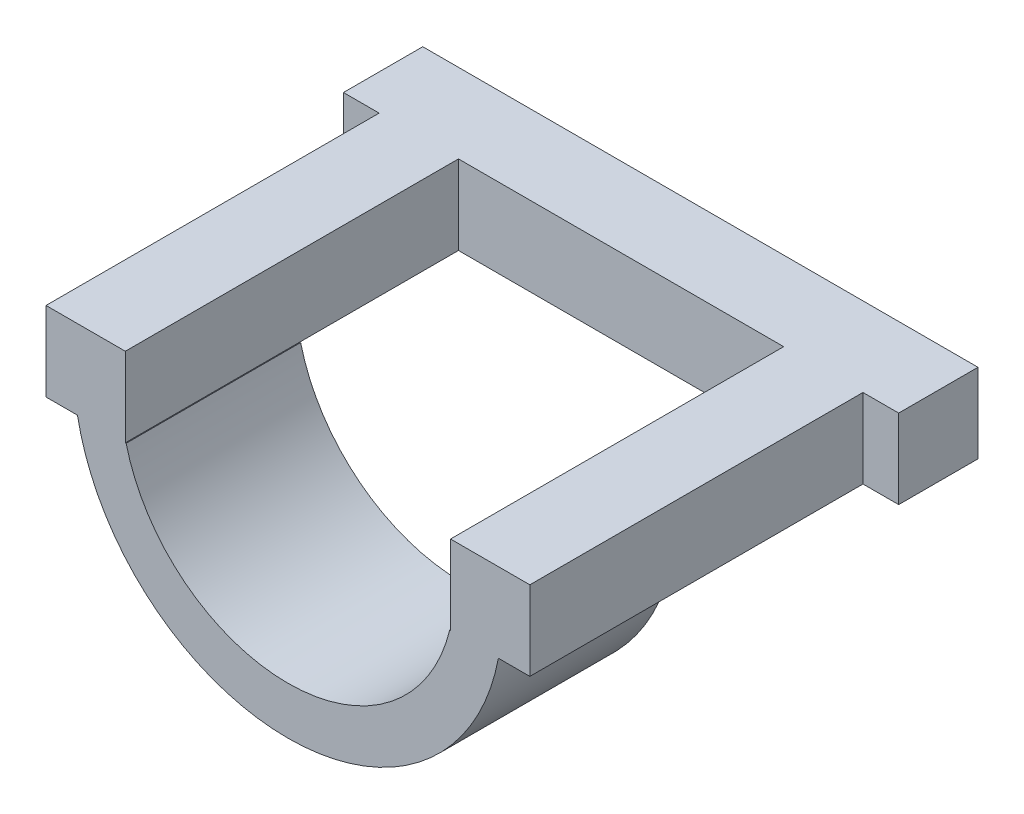
ISO-10303-21;
HEADER;
FILE_DESCRIPTION(('STEP AP214'),'2;1');
FILE_NAME('part.step','',(''),(''),'','','');
FILE_SCHEMA(('AUTOMOTIVE_DESIGN { 1 0 10303 214 1 1 1 1 }'));
ENDSEC;
DATA;
#1=APPLICATION_CONTEXT('core data for automotive mechanical design processes');
#2=APPLICATION_PROTOCOL_DEFINITION('international standard','automotive_design',2000,#1);
#3=PRODUCT_CONTEXT('',#1,'mechanical');
#4=PRODUCT('Part','Part','',(#3));
#5=PRODUCT_RELATED_PRODUCT_CATEGORY('part','',(#4));
#6=PRODUCT_DEFINITION_FORMATION('','',#4);
#7=PRODUCT_DEFINITION_CONTEXT('part definition',#1,'design');
#8=PRODUCT_DEFINITION('design','',#6,#7);
#9=PRODUCT_DEFINITION_SHAPE('','',#8);
#10=(LENGTH_UNIT() NAMED_UNIT(*) SI_UNIT(.MILLI.,.METRE.));
#11=(NAMED_UNIT(*) PLANE_ANGLE_UNIT() SI_UNIT($,.RADIAN.));
#12=(NAMED_UNIT(*) SI_UNIT($,.STERADIAN.) SOLID_ANGLE_UNIT());
#13=UNCERTAINTY_MEASURE_WITH_UNIT(LENGTH_MEASURE(1.E-05),#10,'distance_accuracy_value','');
#14=(GEOMETRIC_REPRESENTATION_CONTEXT(3) GLOBAL_UNCERTAINTY_ASSIGNED_CONTEXT((#13)) GLOBAL_UNIT_ASSIGNED_CONTEXT((#10,
#11,#12)) REPRESENTATION_CONTEXT('',''));
#15=CARTESIAN_POINT('',(0.,0.,0.));
#16=DIRECTION('',(0.,0.,1.));
#17=DIRECTION('',(1.,0.,0.));
#18=AXIS2_PLACEMENT_3D('',#15,#16,#17);
#19=CARTESIAN_POINT('',(0.,10.,0.));
#20=DIRECTION('',(0.,0.,-1.));
#21=DIRECTION('',(-1.,0.,0.));
#22=AXIS2_PLACEMENT_3D('',#19,#20,#21);
#23=PLANE('',#22);
#24=DIRECTION('',(0.,-1.,0.));
#25=VECTOR('',#24,1.);
#26=CARTESIAN_POINT('',(55.5,10.,0.));
#27=LINE('',#26,#25);
#28=CARTESIAN_POINT('',(55.5,10.,0.));
#29=VERTEX_POINT('',#28);
#30=CARTESIAN_POINT('',(55.5,0.,0.));
#31=VERTEX_POINT('',#30);
#32=EDGE_CURVE('E200',#29,#31,#27,.T.);
#33=ORIENTED_EDGE('',*,*,#32,.F.);
#34=DIRECTION('',(1.,0.,0.));
#35=VECTOR('',#34,1.);
#36=CARTESIAN_POINT('',(0.,10.,0.));
#37=LINE('',#36,#35);
#38=CARTESIAN_POINT('',(14.5,10.,0.));
#39=VERTEX_POINT('',#38);
#40=EDGE_CURVE('E252',#39,#29,#37,.T.);
#41=ORIENTED_EDGE('',*,*,#40,.F.);
#42=DIRECTION('',(0.,1.,0.));
#43=VECTOR('',#42,1.);
#44=CARTESIAN_POINT('',(14.5,10.,0.));
#45=LINE('',#44,#43);
#46=CARTESIAN_POINT('',(14.5,0.,0.));
#47=VERTEX_POINT('',#46);
#48=EDGE_CURVE('E220',#47,#39,#45,.T.);
#49=ORIENTED_EDGE('',*,*,#48,.F.);
#50=DIRECTION('',(1.,0.,0.));
#51=VECTOR('',#50,1.);
#52=CARTESIAN_POINT('',(0.,0.,0.));
#53=LINE('',#52,#51);
#54=EDGE_CURVE('E263',#47,#31,#53,.T.);
#55=ORIENTED_EDGE('',*,*,#54,.T.);
#56=EDGE_LOOP('',(#33,#41,#49,#55));
#57=FACE_BOUND('',#56,.T.);
#58=ADVANCED_FACE('F35',(#57),#23,.F.);
#59=DIRECTION('',(0.,1.,0.));
#60=VECTOR('',#59,1.);
#61=CARTESIAN_POINT('',(65.5,10.,0.));
#62=LINE('',#61,#60);
#63=CARTESIAN_POINT('',(65.5,0.,0.));
#64=VERTEX_POINT('',#63);
#65=CARTESIAN_POINT('',(65.5,10.,0.));
#66=VERTEX_POINT('',#65);
#67=EDGE_CURVE('E193',#64,#66,#62,.T.);
#68=ORIENTED_EDGE('',*,*,#67,.F.);
#69=CARTESIAN_POINT('',(70.,0.,0.));
#70=VERTEX_POINT('',#69);
#71=EDGE_CURVE('E259',#64,#70,#53,.T.);
#72=ORIENTED_EDGE('',*,*,#71,.T.);
#73=DIRECTION('',(0.,-1.,0.));
#74=VECTOR('',#73,1.);
#75=CARTESIAN_POINT('',(70.,10.,0.));
#76=LINE('',#75,#74);
#77=CARTESIAN_POINT('',(70.,10.,0.));
#78=VERTEX_POINT('',#77);
#79=EDGE_CURVE('E43',#78,#70,#76,.T.);
#80=ORIENTED_EDGE('',*,*,#79,.F.);
#81=EDGE_CURVE('E58',#66,#78,#37,.T.);
#82=ORIENTED_EDGE('',*,*,#81,.F.);
#83=EDGE_LOOP('',(#68,#72,#80,#82));
#84=FACE_BOUND('',#83,.T.);
#85=ADVANCED_FACE('F306',(#84),#23,.F.);
#86=DIRECTION('',(0.,-1.,0.));
#87=VECTOR('',#86,1.);
#88=CARTESIAN_POINT('',(4.5,10.,0.));
#89=LINE('',#88,#87);
#90=CARTESIAN_POINT('',(4.50000000000001,10.,0.));
#91=VERTEX_POINT('',#90);
#92=CARTESIAN_POINT('',(4.50000000000001,0.,0.));
#93=VERTEX_POINT('',#92);
#94=EDGE_CURVE('E215',#91,#93,#89,.T.);
#95=ORIENTED_EDGE('',*,*,#94,.F.);
#96=CARTESIAN_POINT('',(0.,10.,0.));
#97=VERTEX_POINT('',#96);
#98=EDGE_CURVE('E248',#97,#91,#37,.T.);
#99=ORIENTED_EDGE('',*,*,#98,.F.);
#100=DIRECTION('',(0.,-1.,0.));
#101=VECTOR('',#100,1.);
#102=CARTESIAN_POINT('',(0.,10.,0.));
#103=LINE('',#102,#101);
#104=CARTESIAN_POINT('',(0.,0.,0.));
#105=VERTEX_POINT('',#104);
#106=EDGE_CURVE('E11',#97,#105,#103,.T.);
#107=ORIENTED_EDGE('',*,*,#106,.T.);
#108=EDGE_CURVE('E260',#105,#93,#53,.T.);
#109=ORIENTED_EDGE('',*,*,#108,.T.);
#110=EDGE_LOOP('',(#95,#99,#107,#109));
#111=FACE_BOUND('',#110,.T.);
#112=ADVANCED_FACE('F335',(#111),#23,.F.);
#113=CARTESIAN_POINT('',(0.,10.,0.));
#114=DIRECTION('',(1.,0.,0.));
#115=DIRECTION('',(0.,0.,-1.));
#116=AXIS2_PLACEMENT_3D('',#113,#114,#115);
#117=PLANE('',#116);
#118=DIRECTION('',(0.,0.,1.));
#119=VECTOR('',#118,1.);
#120=CARTESIAN_POINT('',(0.,0.,0.));
#121=LINE('',#120,#119);
#122=CARTESIAN_POINT('',(0.,0.,-10.));
#123=VERTEX_POINT('',#122);
#124=EDGE_CURVE('E243',#123,#105,#121,.T.);
#125=ORIENTED_EDGE('',*,*,#124,.T.);
#126=ORIENTED_EDGE('',*,*,#106,.F.);
#127=DIRECTION('',(0.,0.,1.));
#128=VECTOR('',#127,1.);
#129=CARTESIAN_POINT('',(0.,10.,0.));
#130=LINE('',#129,#128);
#131=CARTESIAN_POINT('',(0.,10.,-10.));
#132=VERTEX_POINT('',#131);
#133=EDGE_CURVE('E244',#132,#97,#130,.T.);
#134=ORIENTED_EDGE('',*,*,#133,.F.);
#135=DIRECTION('',(0.,-1.,0.));
#136=VECTOR('',#135,1.);
#137=CARTESIAN_POINT('',(0.,10.,-10.));
#138=LINE('',#137,#136);
#139=EDGE_CURVE('E256',#132,#123,#138,.T.);
#140=ORIENTED_EDGE('',*,*,#139,.T.);
#141=EDGE_LOOP('',(#125,#126,#134,#140));
#142=FACE_BOUND('',#141,.T.);
#143=ADVANCED_FACE('F37',(#142),#117,.F.);
#144=CARTESIAN_POINT('',(70.,10.,0.));
#145=DIRECTION('',(-1.,0.,0.));
#146=DIRECTION('',(0.,0.,1.));
#147=AXIS2_PLACEMENT_3D('',#144,#145,#146);
#148=PLANE('',#147);
#149=DIRECTION('',(0.,0.,-1.));
#150=VECTOR('',#149,1.);
#151=CARTESIAN_POINT('',(70.,0.,0.));
#152=LINE('',#151,#150);
#153=CARTESIAN_POINT('',(70.,0.,-10.));
#154=VERTEX_POINT('',#153);
#155=EDGE_CURVE('E262',#70,#154,#152,.T.);
#156=ORIENTED_EDGE('',*,*,#155,.T.);
#157=DIRECTION('',(0.,-1.,0.));
#158=VECTOR('',#157,1.);
#159=CARTESIAN_POINT('',(70.,10.,-10.));
#160=LINE('',#159,#158);
#161=CARTESIAN_POINT('',(70.,10.,-10.));
#162=VERTEX_POINT('',#161);
#163=EDGE_CURVE('E268',#162,#154,#160,.T.);
#164=ORIENTED_EDGE('',*,*,#163,.F.);
#165=DIRECTION('',(0.,0.,-1.));
#166=VECTOR('',#165,1.);
#167=CARTESIAN_POINT('',(70.,10.,0.));
#168=LINE('',#167,#166);
#169=EDGE_CURVE('E251',#78,#162,#168,.T.);
#170=ORIENTED_EDGE('',*,*,#169,.F.);
#171=ORIENTED_EDGE('',*,*,#79,.T.);
#172=EDGE_LOOP('',(#156,#164,#170,#171));
#173=FACE_BOUND('',#172,.T.);
#174=ADVANCED_FACE('F274',(#173),#148,.F.);
#175=CARTESIAN_POINT('',(0.,10.,-10.));
#176=DIRECTION('',(0.,0.,1.));
#177=DIRECTION('',(1.,0.,0.));
#178=AXIS2_PLACEMENT_3D('',#175,#176,#177);
#179=PLANE('',#178);
#180=DIRECTION('',(-1.,0.,0.));
#181=VECTOR('',#180,1.);
#182=CARTESIAN_POINT('',(0.,0.,-10.));
#183=LINE('',#182,#181);
#184=EDGE_CURVE('E247',#154,#123,#183,.T.);
#185=ORIENTED_EDGE('',*,*,#184,.T.);
#186=ORIENTED_EDGE('',*,*,#139,.F.);
#187=DIRECTION('',(-1.,0.,0.));
#188=VECTOR('',#187,1.);
#189=CARTESIAN_POINT('',(0.,10.,-10.));
#190=LINE('',#189,#188);
#191=EDGE_CURVE('E254',#162,#132,#190,.T.);
#192=ORIENTED_EDGE('',*,*,#191,.F.);
#193=ORIENTED_EDGE('',*,*,#163,.T.);
#194=EDGE_LOOP('',(#185,#186,#192,#193));
#195=FACE_BOUND('',#194,.T.);
#196=ADVANCED_FACE('F280',(#195),#179,.F.);
#197=CARTESIAN_POINT('',(0.,10.,0.));
#198=DIRECTION('',(0.,-1.,0.));
#199=DIRECTION('',(0.,0.,-1.));
#200=AXIS2_PLACEMENT_3D('',#197,#198,#199);
#201=PLANE('',#200);
#202=ORIENTED_EDGE('',*,*,#133,.T.);
#203=ORIENTED_EDGE('',*,*,#98,.T.);
#204=DIRECTION('',(0.,0.,-1.));
#205=VECTOR('',#204,1.);
#206=CARTESIAN_POINT('',(4.5,10.,42.));
#207=LINE('',#206,#205);
#208=CARTESIAN_POINT('',(4.5,10.,42.));
#209=VERTEX_POINT('',#208);
#210=EDGE_CURVE('E226',#209,#91,#207,.T.);
#211=ORIENTED_EDGE('',*,*,#210,.F.);
#212=DIRECTION('',(-1.,0.,0.));
#213=VECTOR('',#212,1.);
#214=CARTESIAN_POINT('',(4.5,10.,42.));
#215=LINE('',#214,#213);
#216=CARTESIAN_POINT('',(14.5,10.,42.));
#217=VERTEX_POINT('',#216);
#218=EDGE_CURVE('E224',#217,#209,#215,.T.);
#219=ORIENTED_EDGE('',*,*,#218,.F.);
#220=DIRECTION('',(0.,0.,-1.));
#221=VECTOR('',#220,1.);
#222=CARTESIAN_POINT('',(14.5,10.,42.));
#223=LINE('',#222,#221);
#224=EDGE_CURVE('E233',#217,#39,#223,.T.);
#225=ORIENTED_EDGE('',*,*,#224,.T.);
#226=ORIENTED_EDGE('',*,*,#40,.T.);
#227=DIRECTION('',(0.,0.,-1.));
#228=VECTOR('',#227,1.);
#229=CARTESIAN_POINT('',(55.5,10.,42.));
#230=LINE('',#229,#228);
#231=CARTESIAN_POINT('',(55.5,10.,42.));
#232=VERTEX_POINT('',#231);
#233=EDGE_CURVE('E199',#232,#29,#230,.T.);
#234=ORIENTED_EDGE('',*,*,#233,.F.);
#235=DIRECTION('',(-1.,0.,0.));
#236=VECTOR('',#235,1.);
#237=CARTESIAN_POINT('',(55.5,10.,42.));
#238=LINE('',#237,#236);
#239=CARTESIAN_POINT('',(65.5,10.,42.));
#240=VERTEX_POINT('',#239);
#241=EDGE_CURVE('E197',#240,#232,#238,.T.);
#242=ORIENTED_EDGE('',*,*,#241,.F.);
#243=DIRECTION('',(0.,0.,-1.));
#244=VECTOR('',#243,1.);
#245=CARTESIAN_POINT('',(65.5,10.,42.));
#246=LINE('',#245,#244);
#247=EDGE_CURVE('E206',#240,#66,#246,.T.);
#248=ORIENTED_EDGE('',*,*,#247,.T.);
#249=ORIENTED_EDGE('',*,*,#81,.T.);
#250=ORIENTED_EDGE('',*,*,#169,.T.);
#251=ORIENTED_EDGE('',*,*,#191,.T.);
#252=EDGE_LOOP('',(#202,#203,#211,#219,#225,#226,#234,#242,#248,#249,#250,#251));
#253=FACE_BOUND('',#252,.T.);
#254=ADVANCED_FACE('F286',(#253),#201,.F.);
#255=CARTESIAN_POINT('',(0.,0.,0.));
#256=DIRECTION('',(0.,-1.,0.));
#257=DIRECTION('',(0.,0.,-1.));
#258=AXIS2_PLACEMENT_3D('',#255,#256,#257);
#259=PLANE('',#258);
#260=DIRECTION('',(0.,0.,1.));
#261=VECTOR('',#260,1.);
#262=CARTESIAN_POINT('',(61.5329983228432,0.,20.));
#263=LINE('',#262,#261);
#264=CARTESIAN_POINT('',(61.5329983228432,0.,20.));
#265=VERTEX_POINT('',#264);
#266=CARTESIAN_POINT('',(61.5329983228432,0.,42.));
#267=VERTEX_POINT('',#266);
#268=EDGE_CURVE('E170',#265,#267,#263,.T.);
#269=ORIENTED_EDGE('',*,*,#268,.F.);
#270=DIRECTION('',(-1.,0.,0.));
#271=VECTOR('',#270,1.);
#272=CARTESIAN_POINT('',(55.3960780543711,0.,20.));
#273=LINE('',#272,#271);
#274=CARTESIAN_POINT('',(55.5,0.,20.));
#275=VERTEX_POINT('',#274);
#276=EDGE_CURVE('E156',#265,#275,#273,.T.);
#277=ORIENTED_EDGE('',*,*,#276,.T.);
#278=DIRECTION('',(0.,0.,-1.));
#279=VECTOR('',#278,1.);
#280=CARTESIAN_POINT('',(55.5,0.,42.));
#281=LINE('',#280,#279);
#282=EDGE_CURVE('E212',#275,#31,#281,.T.);
#283=ORIENTED_EDGE('',*,*,#282,.T.);
#284=ORIENTED_EDGE('',*,*,#54,.F.);
#285=DIRECTION('',(0.,0.,-1.));
#286=VECTOR('',#285,1.);
#287=CARTESIAN_POINT('',(14.5,0.,42.));
#288=LINE('',#287,#286);
#289=CARTESIAN_POINT('',(14.5,0.,20.));
#290=VERTEX_POINT('',#289);
#291=EDGE_CURVE('E236',#290,#47,#288,.T.);
#292=ORIENTED_EDGE('',*,*,#291,.F.);
#293=DIRECTION('',(-1.,0.,0.));
#294=VECTOR('',#293,1.);
#295=CARTESIAN_POINT('',(8.46700167715681,0.,20.));
#296=LINE('',#295,#294);
#297=CARTESIAN_POINT('',(8.46700167715681,0.,20.));
#298=VERTEX_POINT('',#297);
#299=EDGE_CURVE('E186',#290,#298,#296,.T.);
#300=ORIENTED_EDGE('',*,*,#299,.T.);
#301=DIRECTION('',(0.,0.,1.));
#302=VECTOR('',#301,1.);
#303=CARTESIAN_POINT('',(8.46700167715681,0.,20.));
#304=LINE('',#303,#302);
#305=CARTESIAN_POINT('',(8.46700167715681,0.,42.));
#306=VERTEX_POINT('',#305);
#307=EDGE_CURVE('E173',#298,#306,#304,.T.);
#308=ORIENTED_EDGE('',*,*,#307,.T.);
#309=DIRECTION('',(1.,0.,0.));
#310=VECTOR('',#309,1.);
#311=CARTESIAN_POINT('',(4.50000000000001,0.,42.));
#312=LINE('',#311,#310);
#313=CARTESIAN_POINT('',(4.50000000000001,0.,42.));
#314=VERTEX_POINT('',#313);
#315=EDGE_CURVE('E219',#314,#306,#312,.T.);
#316=ORIENTED_EDGE('',*,*,#315,.F.);
#317=DIRECTION('',(0.,0.,-1.));
#318=VECTOR('',#317,1.);
#319=CARTESIAN_POINT('',(4.50000000000001,0.,42.));
#320=LINE('',#319,#318);
#321=EDGE_CURVE('E240',#314,#93,#320,.T.);
#322=ORIENTED_EDGE('',*,*,#321,.T.);
#323=ORIENTED_EDGE('',*,*,#108,.F.);
#324=ORIENTED_EDGE('',*,*,#124,.F.);
#325=ORIENTED_EDGE('',*,*,#184,.F.);
#326=ORIENTED_EDGE('',*,*,#155,.F.);
#327=ORIENTED_EDGE('',*,*,#71,.F.);
#328=DIRECTION('',(0.,0.,-1.));
#329=VECTOR('',#328,1.);
#330=CARTESIAN_POINT('',(65.5,0.,42.));
#331=LINE('',#330,#329);
#332=CARTESIAN_POINT('',(65.5,0.,42.));
#333=VERTEX_POINT('',#332);
#334=EDGE_CURVE('E209',#333,#64,#331,.T.);
#335=ORIENTED_EDGE('',*,*,#334,.F.);
#336=DIRECTION('',(1.,0.,0.));
#337=VECTOR('',#336,1.);
#338=CARTESIAN_POINT('',(55.5,0.,42.));
#339=LINE('',#338,#337);
#340=EDGE_CURVE('E178',#267,#333,#339,.T.);
#341=ORIENTED_EDGE('',*,*,#340,.F.);
#342=EDGE_LOOP('',(#269,#277,#283,#284,#292,#300,#308,#316,#322,#323,#324,#325,#326,#327,#335,#341));
#343=FACE_BOUND('',#342,.T.);
#344=ADVANCED_FACE('F176',(#343),#259,.T.);
#345=CARTESIAN_POINT('',(4.5,10.,42.));
#346=DIRECTION('',(1.,0.,0.));
#347=DIRECTION('',(0.,1.,0.));
#348=AXIS2_PLACEMENT_3D('',#345,#346,#347);
#349=PLANE('',#348);
#350=ORIENTED_EDGE('',*,*,#94,.T.);
#351=ORIENTED_EDGE('',*,*,#321,.F.);
#352=DIRECTION('',(0.,-1.,0.));
#353=VECTOR('',#352,1.);
#354=CARTESIAN_POINT('',(4.5,10.,42.));
#355=LINE('',#354,#353);
#356=EDGE_CURVE('E216',#209,#314,#355,.T.);
#357=ORIENTED_EDGE('',*,*,#356,.F.);
#358=ORIENTED_EDGE('',*,*,#210,.T.);
#359=EDGE_LOOP('',(#350,#351,#357,#358));
#360=FACE_BOUND('',#359,.T.);
#361=ADVANCED_FACE('F333',(#360),#349,.F.);
#362=CARTESIAN_POINT('',(14.5,10.,42.));
#363=DIRECTION('',(-1.,0.,0.));
#364=DIRECTION('',(0.,-1.,0.));
#365=AXIS2_PLACEMENT_3D('',#362,#363,#364);
#366=PLANE('',#365);
#367=ORIENTED_EDGE('',*,*,#48,.T.);
#368=ORIENTED_EDGE('',*,*,#224,.F.);
#369=DIRECTION('',(0.,1.,0.));
#370=VECTOR('',#369,1.);
#371=CARTESIAN_POINT('',(14.5,10.,42.));
#372=LINE('',#371,#370);
#373=CARTESIAN_POINT('',(14.5,0.,42.));
#374=VERTEX_POINT('',#373);
#375=EDGE_CURVE('E222',#374,#217,#372,.T.);
#376=ORIENTED_EDGE('',*,*,#375,.F.);
#377=EDGE_CURVE('E237',#374,#290,#288,.T.);
#378=ORIENTED_EDGE('',*,*,#377,.T.);
#379=ORIENTED_EDGE('',*,*,#291,.T.);
#380=EDGE_LOOP('',(#367,#368,#376,#378,#379));
#381=FACE_BOUND('',#380,.T.);
#382=ADVANCED_FACE('F313',(#381),#366,.F.);
#383=CARTESIAN_POINT('',(0.,0.,42.));
#384=DIRECTION('',(0.,0.,1.));
#385=DIRECTION('',(1.,0.,0.));
#386=AXIS2_PLACEMENT_3D('',#383,#384,#385);
#387=PLANE('',#386);
#388=ORIENTED_EDGE('',*,*,#356,.T.);
#389=ORIENTED_EDGE('',*,*,#315,.T.);
#390=CARTESIAN_POINT('',(35.,5.,42.));
#391=DIRECTION('',(0.,0.,1.));
#392=DIRECTION('',(1.,0.,0.));
#393=AXIS2_PLACEMENT_3D('',#390,#391,#392);
#394=CIRCLE('',#393,27.);
#395=EDGE_CURVE('E50',#306,#267,#394,.T.);
#396=ORIENTED_EDGE('',*,*,#395,.T.);
#397=ORIENTED_EDGE('',*,*,#340,.T.);
#398=DIRECTION('',(0.,1.,0.));
#399=VECTOR('',#398,1.);
#400=CARTESIAN_POINT('',(65.5,10.,42.));
#401=LINE('',#400,#399);
#402=EDGE_CURVE('E195',#333,#240,#401,.T.);
#403=ORIENTED_EDGE('',*,*,#402,.T.);
#404=ORIENTED_EDGE('',*,*,#241,.T.);
#405=DIRECTION('',(0.,-1.,0.));
#406=VECTOR('',#405,1.);
#407=CARTESIAN_POINT('',(55.5,10.,42.));
#408=LINE('',#407,#406);
#409=CARTESIAN_POINT('',(55.5,0.,42.));
#410=VERTEX_POINT('',#409);
#411=EDGE_CURVE('E190',#232,#410,#408,.T.);
#412=ORIENTED_EDGE('',*,*,#411,.T.);
#413=DIRECTION('',(-1.,0.,0.));
#414=VECTOR('',#413,1.);
#415=CARTESIAN_POINT('',(55.3960780543711,0.,42.));
#416=LINE('',#415,#414);
#417=CARTESIAN_POINT('',(55.3960780543711,0.,42.));
#418=VERTEX_POINT('',#417);
#419=EDGE_CURVE('E302',#410,#418,#416,.T.);
#420=ORIENTED_EDGE('',*,*,#419,.T.);
#421=CARTESIAN_POINT('',(35.,5.,42.));
#422=DIRECTION('',(0.,0.,-1.));
#423=DIRECTION('',(1.,0.,0.));
#424=AXIS2_PLACEMENT_3D('',#421,#422,#423);
#425=CIRCLE('',#424,21.);
#426=CARTESIAN_POINT('',(14.6039219456289,0.,42.));
#427=VERTEX_POINT('',#426);
#428=EDGE_CURVE('E323',#418,#427,#425,.T.);
#429=ORIENTED_EDGE('',*,*,#428,.T.);
#430=DIRECTION('',(-1.,0.,0.));
#431=VECTOR('',#430,1.);
#432=CARTESIAN_POINT('',(8.46700167715681,0.,42.));
#433=LINE('',#432,#431);
#434=EDGE_CURVE('E174',#427,#374,#433,.T.);
#435=ORIENTED_EDGE('',*,*,#434,.T.);
#436=ORIENTED_EDGE('',*,*,#375,.T.);
#437=ORIENTED_EDGE('',*,*,#218,.T.);
#438=EDGE_LOOP('',(#388,#389,#396,#397,#403,#404,#412,#420,#429,#435,#436,#437));
#439=FACE_BOUND('',#438,.T.);
#440=ADVANCED_FACE('F300',(#439),#387,.T.);
#441=CARTESIAN_POINT('',(55.5,10.,42.));
#442=DIRECTION('',(1.,0.,0.));
#443=DIRECTION('',(0.,0.,-1.));
#444=AXIS2_PLACEMENT_3D('',#441,#442,#443);
#445=PLANE('',#444);
#446=ORIENTED_EDGE('',*,*,#32,.T.);
#447=ORIENTED_EDGE('',*,*,#282,.F.);
#448=EDGE_CURVE('E213',#410,#275,#281,.T.);
#449=ORIENTED_EDGE('',*,*,#448,.F.);
#450=ORIENTED_EDGE('',*,*,#411,.F.);
#451=ORIENTED_EDGE('',*,*,#233,.T.);
#452=EDGE_LOOP('',(#446,#447,#449,#450,#451));
#453=FACE_BOUND('',#452,.T.);
#454=ADVANCED_FACE('F298',(#453),#445,.F.);
#455=CARTESIAN_POINT('',(65.5,10.,42.));
#456=DIRECTION('',(-1.,0.,0.));
#457=DIRECTION('',(0.,0.,1.));
#458=AXIS2_PLACEMENT_3D('',#455,#456,#457);
#459=PLANE('',#458);
#460=ORIENTED_EDGE('',*,*,#67,.T.);
#461=ORIENTED_EDGE('',*,*,#247,.F.);
#462=ORIENTED_EDGE('',*,*,#402,.F.);
#463=ORIENTED_EDGE('',*,*,#334,.T.);
#464=EDGE_LOOP('',(#460,#461,#462,#463));
#465=FACE_BOUND('',#464,.T.);
#466=ADVANCED_FACE('F305',(#465),#459,.F.);
#467=CARTESIAN_POINT('',(8.46700167715681,0.,20.));
#468=DIRECTION('',(0.,1.,0.));
#469=DIRECTION('',(0.,0.,1.));
#470=AXIS2_PLACEMENT_3D('',#467,#468,#469);
#471=PLANE('',#470);
#472=ORIENTED_EDGE('',*,*,#377,.F.);
#473=ORIENTED_EDGE('',*,*,#434,.F.);
#474=DIRECTION('',(0.,0.,1.));
#475=VECTOR('',#474,1.);
#476=CARTESIAN_POINT('',(14.6039219456289,0.,20.));
#477=LINE('',#476,#475);
#478=CARTESIAN_POINT('',(14.6039219456289,0.,20.));
#479=VERTEX_POINT('',#478);
#480=EDGE_CURVE('E183',#479,#427,#477,.T.);
#481=ORIENTED_EDGE('',*,*,#480,.F.);
#482=EDGE_CURVE('E180',#479,#290,#296,.T.);
#483=ORIENTED_EDGE('',*,*,#482,.T.);
#484=EDGE_LOOP('',(#472,#473,#481,#483));
#485=FACE_BOUND('',#484,.T.);
#486=ADVANCED_FACE('F316',(#485),#471,.T.);
#487=CARTESIAN_POINT('',(55.3960780543711,0.,20.));
#488=DIRECTION('',(0.,1.,0.));
#489=DIRECTION('',(0.,0.,1.));
#490=AXIS2_PLACEMENT_3D('',#487,#488,#489);
#491=PLANE('',#490);
#492=ORIENTED_EDGE('',*,*,#448,.T.);
#493=CARTESIAN_POINT('',(55.3960780543711,0.,20.));
#494=VERTEX_POINT('',#493);
#495=EDGE_CURVE('E162',#275,#494,#273,.T.);
#496=ORIENTED_EDGE('',*,*,#495,.T.);
#497=DIRECTION('',(0.,0.,1.));
#498=VECTOR('',#497,1.);
#499=CARTESIAN_POINT('',(55.3960780543711,0.,20.));
#500=LINE('',#499,#498);
#501=EDGE_CURVE('E179',#494,#418,#500,.T.);
#502=ORIENTED_EDGE('',*,*,#501,.T.);
#503=ORIENTED_EDGE('',*,*,#419,.F.);
#504=EDGE_LOOP('',(#492,#496,#502,#503));
#505=FACE_BOUND('',#504,.T.);
#506=ADVANCED_FACE('F419',(#505),#491,.T.);
#507=CARTESIAN_POINT('',(35.,5.,20.));
#508=DIRECTION('',(0.,0.,1.));
#509=DIRECTION('',(1.,0.,0.));
#510=AXIS2_PLACEMENT_3D('',#507,#508,#509);
#511=CYLINDRICAL_SURFACE('',#510,27.);
#512=ORIENTED_EDGE('',*,*,#395,.F.);
#513=ORIENTED_EDGE('',*,*,#307,.F.);
#514=CARTESIAN_POINT('',(35.,5.,20.));
#515=DIRECTION('',(0.,0.,1.));
#516=DIRECTION('',(1.,0.,0.));
#517=AXIS2_PLACEMENT_3D('',#514,#515,#516);
#518=CIRCLE('',#517,27.);
#519=EDGE_CURVE('E159',#298,#265,#518,.T.);
#520=ORIENTED_EDGE('',*,*,#519,.T.);
#521=ORIENTED_EDGE('',*,*,#268,.T.);
#522=EDGE_LOOP('',(#512,#513,#520,#521));
#523=FACE_BOUND('',#522,.T.);
#524=ADVANCED_FACE('F169',(#523),#511,.T.);
#525=CARTESIAN_POINT('',(35.,5.,20.));
#526=DIRECTION('',(0.,0.,1.));
#527=DIRECTION('',(1.,0.,0.));
#528=AXIS2_PLACEMENT_3D('',#525,#526,#527);
#529=CYLINDRICAL_SURFACE('',#528,21.);
#530=ORIENTED_EDGE('',*,*,#428,.F.);
#531=ORIENTED_EDGE('',*,*,#501,.F.);
#532=CARTESIAN_POINT('',(35.,5.,20.));
#533=DIRECTION('',(0.,0.,-1.));
#534=DIRECTION('',(1.,0.,0.));
#535=AXIS2_PLACEMENT_3D('',#532,#533,#534);
#536=CIRCLE('',#535,21.);
#537=EDGE_CURVE('E166',#494,#479,#536,.T.);
#538=ORIENTED_EDGE('',*,*,#537,.T.);
#539=ORIENTED_EDGE('',*,*,#480,.T.);
#540=EDGE_LOOP('',(#530,#531,#538,#539));
#541=FACE_BOUND('',#540,.T.);
#542=ADVANCED_FACE('F328',(#541),#529,.F.);
#543=CARTESIAN_POINT('',(35.,5.,20.));
#544=DIRECTION('',(0.,0.,1.));
#545=DIRECTION('',(1.,0.,0.));
#546=AXIS2_PLACEMENT_3D('',#543,#544,#545);
#547=PLANE('',#546);
#548=ORIENTED_EDGE('',*,*,#519,.F.);
#549=ORIENTED_EDGE('',*,*,#299,.F.);
#550=ORIENTED_EDGE('',*,*,#482,.F.);
#551=ORIENTED_EDGE('',*,*,#537,.F.);
#552=ORIENTED_EDGE('',*,*,#495,.F.);
#553=ORIENTED_EDGE('',*,*,#276,.F.);
#554=EDGE_LOOP('',(#548,#549,#550,#551,#552,#553));
#555=FACE_BOUND('',#554,.T.);
#556=ADVANCED_FACE('F158',(#555),#547,.F.);
#557=CLOSED_SHELL('',(#58,#85,#112,#143,#174,#196,#254,#344,#361,#382,#440,#454,#466,#486,#506,
#524,#542,#556));
#558=MANIFOLD_SOLID_BREP('B2',#557);
#559=ADVANCED_BREP_SHAPE_REPRESENTATION('',(#18,#558),#14);
#560=SHAPE_DEFINITION_REPRESENTATION(#9,#559);
ENDSEC;
END-ISO-10303-21;
